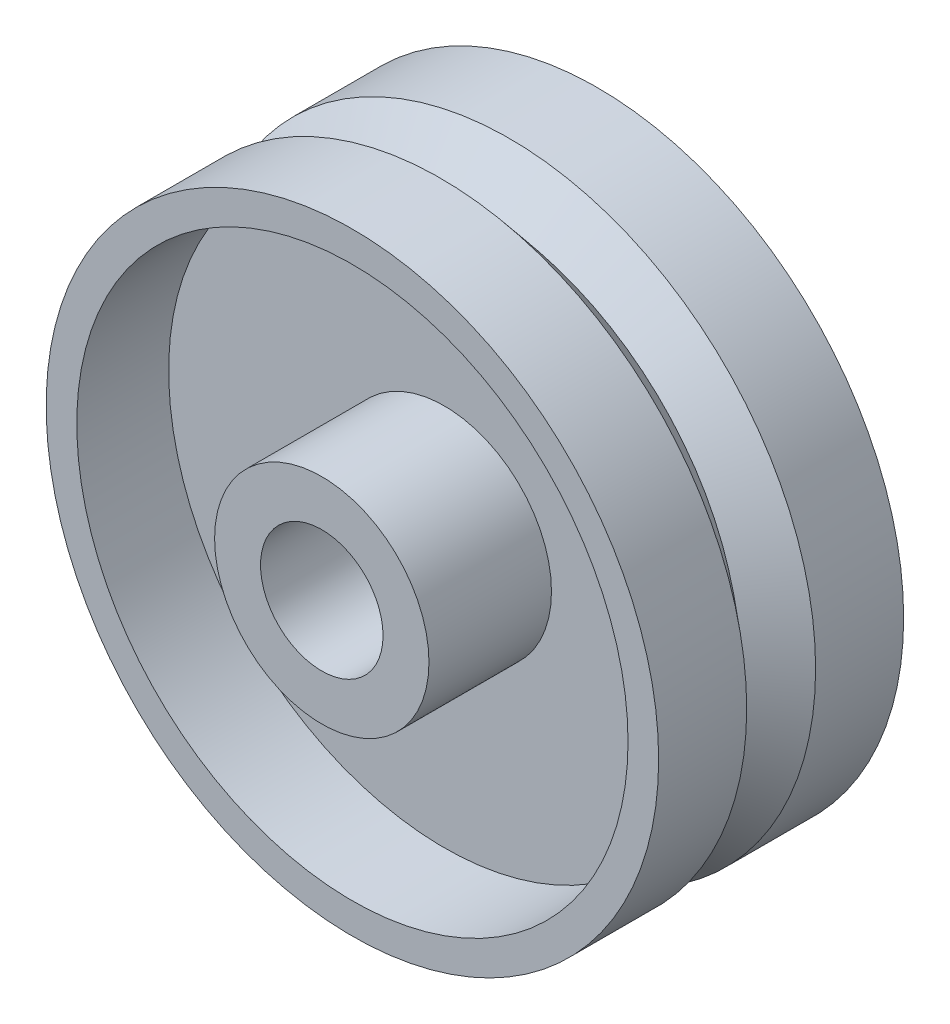
ISO-10303-21;
HEADER;
FILE_DESCRIPTION(('STEP AP214'),'2;1');
FILE_NAME('part.step','',(''),(''),'','','');
FILE_SCHEMA(('AUTOMOTIVE_DESIGN { 1 0 10303 214 1 1 1 1 }'));
ENDSEC;
DATA;
#1=APPLICATION_CONTEXT('core data for automotive mechanical design processes');
#2=APPLICATION_PROTOCOL_DEFINITION('international standard','automotive_design',2000,#1);
#3=PRODUCT_CONTEXT('',#1,'mechanical');
#4=PRODUCT('Part','Part','',(#3));
#5=PRODUCT_RELATED_PRODUCT_CATEGORY('part','',(#4));
#6=PRODUCT_DEFINITION_FORMATION('','',#4);
#7=PRODUCT_DEFINITION_CONTEXT('part definition',#1,'design');
#8=PRODUCT_DEFINITION('design','',#6,#7);
#9=PRODUCT_DEFINITION_SHAPE('','',#8);
#10=(LENGTH_UNIT() NAMED_UNIT(*) SI_UNIT(.MILLI.,.METRE.));
#11=(NAMED_UNIT(*) PLANE_ANGLE_UNIT() SI_UNIT($,.RADIAN.));
#12=(NAMED_UNIT(*) SI_UNIT($,.STERADIAN.) SOLID_ANGLE_UNIT());
#13=UNCERTAINTY_MEASURE_WITH_UNIT(LENGTH_MEASURE(1.E-05),#10,'distance_accuracy_value','');
#14=(GEOMETRIC_REPRESENTATION_CONTEXT(3) GLOBAL_UNCERTAINTY_ASSIGNED_CONTEXT((#13)) GLOBAL_UNIT_ASSIGNED_CONTEXT((#10,
#11,#12)) REPRESENTATION_CONTEXT('',''));
#15=CARTESIAN_POINT('',(0.,0.,0.));
#16=DIRECTION('',(0.,0.,1.));
#17=DIRECTION('',(1.,0.,0.));
#18=AXIS2_PLACEMENT_3D('',#15,#16,#17);
#19=CARTESIAN_POINT('',(0.,10.,25.));
#20=DIRECTION('',(0.,0.,-1.));
#21=DIRECTION('',(-1.,0.,0.));
#22=AXIS2_PLACEMENT_3D('',#19,#20,#21);
#23=PLANE('',#22);
#24=CARTESIAN_POINT('',(0.,0.,25.));
#25=DIRECTION('',(0.,0.,1.));
#26=DIRECTION('',(1.,0.,0.));
#27=AXIS2_PLACEMENT_3D('',#24,#25,#26);
#28=CIRCLE('',#27,10.);
#29=CARTESIAN_POINT('',(10.,0.,25.));
#30=VERTEX_POINT('',#29);
#31=EDGE_CURVE('E86',#30,#30,#28,.T.);
#32=ORIENTED_EDGE('',*,*,#31,.F.);
#33=EDGE_LOOP('',(#32));
#34=FACE_BOUND('',#33,.T.);
#35=CARTESIAN_POINT('',(0.,0.,25.));
#36=DIRECTION('',(0.,0.,1.));
#37=DIRECTION('',(1.,0.,0.));
#38=AXIS2_PLACEMENT_3D('',#35,#36,#37);
#39=CIRCLE('',#38,17.5);
#40=CARTESIAN_POINT('',(17.5,0.,25.));
#41=VERTEX_POINT('',#40);
#42=EDGE_CURVE('E10',#41,#41,#39,.T.);
#43=ORIENTED_EDGE('',*,*,#42,.T.);
#44=EDGE_LOOP('',(#43));
#45=FACE_BOUND('',#44,.T.);
#46=ADVANCED_FACE('F37',(#34,#45),#23,.F.);
#47=CARTESIAN_POINT('',(0.,0.,0.));
#48=DIRECTION('',(0.,0.,1.));
#49=DIRECTION('',(1.,0.,0.));
#50=AXIS2_PLACEMENT_3D('',#47,#48,#49);
#51=CYLINDRICAL_SURFACE('',#50,17.5);
#52=ORIENTED_EDGE('',*,*,#42,.F.);
#53=EDGE_LOOP('',(#52));
#54=FACE_BOUND('',#53,.T.);
#55=CARTESIAN_POINT('',(0.,0.,5.));
#56=DIRECTION('',(0.,0.,1.));
#57=DIRECTION('',(1.,0.,0.));
#58=AXIS2_PLACEMENT_3D('',#55,#56,#57);
#59=CIRCLE('',#58,17.5);
#60=CARTESIAN_POINT('',(17.5,0.,5.));
#61=VERTEX_POINT('',#60);
#62=EDGE_CURVE('E43',#61,#61,#59,.T.);
#63=ORIENTED_EDGE('',*,*,#62,.T.);
#64=EDGE_LOOP('',(#63));
#65=FACE_BOUND('',#64,.T.);
#66=ADVANCED_FACE('F93',(#54,#65),#51,.T.);
#67=CARTESIAN_POINT('',(0.,17.5,5.));
#68=DIRECTION('',(0.,0.,-1.));
#69=DIRECTION('',(-1.,0.,0.));
#70=AXIS2_PLACEMENT_3D('',#67,#68,#69);
#71=PLANE('',#70);
#72=ORIENTED_EDGE('',*,*,#62,.F.);
#73=EDGE_LOOP('',(#72));
#74=FACE_BOUND('',#73,.T.);
#75=CARTESIAN_POINT('',(0.,0.,5.00000000000001));
#76=DIRECTION('',(0.,0.,1.));
#77=DIRECTION('',(1.,0.,0.));
#78=AXIS2_PLACEMENT_3D('',#75,#76,#77);
#79=CIRCLE('',#78,45.);
#80=CARTESIAN_POINT('',(45.,0.,5.00000000000001));
#81=VERTEX_POINT('',#80);
#82=EDGE_CURVE('E47',#81,#81,#79,.T.);
#83=ORIENTED_EDGE('',*,*,#82,.T.);
#84=EDGE_LOOP('',(#83));
#85=FACE_BOUND('',#84,.T.);
#86=ADVANCED_FACE('F97',(#74,#85),#71,.F.);
#87=CARTESIAN_POINT('',(0.,0.,0.));
#88=DIRECTION('',(0.,0.,1.));
#89=DIRECTION('',(1.,0.,0.));
#90=AXIS2_PLACEMENT_3D('',#87,#88,#89);
#91=CYLINDRICAL_SURFACE('',#90,45.);
#92=ORIENTED_EDGE('',*,*,#82,.F.);
#93=EDGE_LOOP('',(#92));
#94=FACE_BOUND('',#93,.T.);
#95=CARTESIAN_POINT('',(0.,0.,20.));
#96=DIRECTION('',(0.,0.,1.));
#97=DIRECTION('',(1.,0.,0.));
#98=AXIS2_PLACEMENT_3D('',#95,#96,#97);
#99=CIRCLE('',#98,45.);
#100=CARTESIAN_POINT('',(45.,0.,20.));
#101=VERTEX_POINT('',#100);
#102=EDGE_CURVE('E51',#101,#101,#99,.T.);
#103=ORIENTED_EDGE('',*,*,#102,.T.);
#104=EDGE_LOOP('',(#103));
#105=FACE_BOUND('',#104,.T.);
#106=ADVANCED_FACE('F102',(#94,#105),#91,.F.);
#107=CARTESIAN_POINT('',(0.,45.,20.));
#108=DIRECTION('',(0.,0.,-1.));
#109=DIRECTION('',(-1.,0.,0.));
#110=AXIS2_PLACEMENT_3D('',#107,#108,#109);
#111=PLANE('',#110);
#112=ORIENTED_EDGE('',*,*,#102,.F.);
#113=EDGE_LOOP('',(#112));
#114=FACE_BOUND('',#113,.T.);
#115=CARTESIAN_POINT('',(0.,0.,20.));
#116=DIRECTION('',(0.,0.,1.));
#117=DIRECTION('',(1.,0.,0.));
#118=AXIS2_PLACEMENT_3D('',#115,#116,#117);
#119=CIRCLE('',#118,50.);
#120=CARTESIAN_POINT('',(50.,0.,20.));
#121=VERTEX_POINT('',#120);
#122=EDGE_CURVE('E56',#121,#121,#119,.T.);
#123=ORIENTED_EDGE('',*,*,#122,.T.);
#124=EDGE_LOOP('',(#123));
#125=FACE_BOUND('',#124,.T.);
#126=ADVANCED_FACE('F108',(#114,#125),#111,.F.);
#127=CARTESIAN_POINT('',(0.,0.,0.));
#128=DIRECTION('',(0.,0.,1.));
#129=DIRECTION('',(1.,0.,0.));
#130=AXIS2_PLACEMENT_3D('',#127,#128,#129);
#131=CYLINDRICAL_SURFACE('',#130,50.);
#132=ORIENTED_EDGE('',*,*,#122,.F.);
#133=EDGE_LOOP('',(#132));
#134=FACE_BOUND('',#133,.T.);
#135=CARTESIAN_POINT('',(0.,0.,5.62522963797609));
#136=DIRECTION('',(0.,0.,1.));
#137=DIRECTION('',(1.,0.,0.));
#138=AXIS2_PLACEMENT_3D('',#135,#136,#137);
#139=CIRCLE('',#138,50.);
#140=CARTESIAN_POINT('',(50.,0.,5.62522963797609));
#141=VERTEX_POINT('',#140);
#142=EDGE_CURVE('E59',#141,#141,#139,.T.);
#143=ORIENTED_EDGE('',*,*,#142,.T.);
#144=EDGE_LOOP('',(#143));
#145=FACE_BOUND('',#144,.T.);
#146=ADVANCED_FACE('F112',(#134,#145),#131,.T.);
#147=CARTESIAN_POINT('',(0.,0.,0.));
#148=DIRECTION('',(0.,0.,1.));
#149=DIRECTION('',(1.,0.,0.));
#150=AXIS2_PLACEMENT_3D('',#147,#148,#149);
#151=CONICAL_SURFACE('',#150,43.2961123697745,0.872664625997171);
#152=ORIENTED_EDGE('',*,*,#142,.F.);
#153=EDGE_LOOP('',(#152));
#154=FACE_BOUND('',#153,.T.);
#155=CARTESIAN_POINT('',(0.,0.,0.));
#156=DIRECTION('',(0.,0.,1.));
#157=DIRECTION('',(1.,0.,0.));
#158=AXIS2_PLACEMENT_3D('',#155,#156,#157);
#159=CIRCLE('',#158,43.2961123697745);
#160=CARTESIAN_POINT('',(43.2961123697745,0.,0.));
#161=VERTEX_POINT('',#160);
#162=EDGE_CURVE('E62',#161,#161,#159,.T.);
#163=ORIENTED_EDGE('',*,*,#162,.T.);
#164=EDGE_LOOP('',(#163));
#165=FACE_BOUND('',#164,.T.);
#166=ADVANCED_FACE('F116',(#154,#165),#151,.T.);
#167=CARTESIAN_POINT('',(0.,0.,-5.6252296379761));
#168=DIRECTION('',(0.,0.,-1.));
#169=DIRECTION('',(-1.,0.,0.));
#170=AXIS2_PLACEMENT_3D('',#167,#168,#169);
#171=CONICAL_SURFACE('',#170,50.,0.872664625997171);
#172=ORIENTED_EDGE('',*,*,#162,.F.);
#173=EDGE_LOOP('',(#172));
#174=FACE_BOUND('',#173,.T.);
#175=CARTESIAN_POINT('',(0.,0.,-5.6252296379761));
#176=DIRECTION('',(0.,0.,1.));
#177=DIRECTION('',(1.,0.,0.));
#178=AXIS2_PLACEMENT_3D('',#175,#176,#177);
#179=CIRCLE('',#178,50.);
#180=CARTESIAN_POINT('',(50.,0.,-5.6252296379761));
#181=VERTEX_POINT('',#180);
#182=EDGE_CURVE('E65',#181,#181,#179,.T.);
#183=ORIENTED_EDGE('',*,*,#182,.T.);
#184=EDGE_LOOP('',(#183));
#185=FACE_BOUND('',#184,.T.);
#186=ADVANCED_FACE('F120',(#174,#185),#171,.T.);
#187=CARTESIAN_POINT('',(0.,0.,0.));
#188=DIRECTION('',(0.,0.,1.));
#189=DIRECTION('',(1.,0.,0.));
#190=AXIS2_PLACEMENT_3D('',#187,#188,#189);
#191=CYLINDRICAL_SURFACE('',#190,50.);
#192=ORIENTED_EDGE('',*,*,#182,.F.);
#193=EDGE_LOOP('',(#192));
#194=FACE_BOUND('',#193,.T.);
#195=CARTESIAN_POINT('',(0.,0.,-20.));
#196=DIRECTION('',(0.,0.,1.));
#197=DIRECTION('',(1.,0.,0.));
#198=AXIS2_PLACEMENT_3D('',#195,#196,#197);
#199=CIRCLE('',#198,50.);
#200=CARTESIAN_POINT('',(50.,0.,-20.));
#201=VERTEX_POINT('',#200);
#202=EDGE_CURVE('E68',#201,#201,#199,.T.);
#203=ORIENTED_EDGE('',*,*,#202,.T.);
#204=EDGE_LOOP('',(#203));
#205=FACE_BOUND('',#204,.T.);
#206=ADVANCED_FACE('F124',(#194,#205),#191,.T.);
#207=CARTESIAN_POINT('',(0.,50.,-20.));
#208=DIRECTION('',(0.,0.,1.));
#209=DIRECTION('',(1.,0.,0.));
#210=AXIS2_PLACEMENT_3D('',#207,#208,#209);
#211=PLANE('',#210);
#212=ORIENTED_EDGE('',*,*,#202,.F.);
#213=EDGE_LOOP('',(#212));
#214=FACE_BOUND('',#213,.T.);
#215=CARTESIAN_POINT('',(0.,0.,-20.));
#216=DIRECTION('',(0.,0.,1.));
#217=DIRECTION('',(1.,0.,0.));
#218=AXIS2_PLACEMENT_3D('',#215,#216,#217);
#219=CIRCLE('',#218,45.);
#220=CARTESIAN_POINT('',(45.,0.,-20.));
#221=VERTEX_POINT('',#220);
#222=EDGE_CURVE('E71',#221,#221,#219,.T.);
#223=ORIENTED_EDGE('',*,*,#222,.T.);
#224=EDGE_LOOP('',(#223));
#225=FACE_BOUND('',#224,.T.);
#226=ADVANCED_FACE('F128',(#214,#225),#211,.F.);
#227=CARTESIAN_POINT('',(0.,0.,0.));
#228=DIRECTION('',(0.,0.,1.));
#229=DIRECTION('',(1.,0.,0.));
#230=AXIS2_PLACEMENT_3D('',#227,#228,#229);
#231=CYLINDRICAL_SURFACE('',#230,45.);
#232=ORIENTED_EDGE('',*,*,#222,.F.);
#233=EDGE_LOOP('',(#232));
#234=FACE_BOUND('',#233,.T.);
#235=CARTESIAN_POINT('',(0.,0.,-4.99999999999999));
#236=DIRECTION('',(0.,0.,1.));
#237=DIRECTION('',(1.,0.,0.));
#238=AXIS2_PLACEMENT_3D('',#235,#236,#237);
#239=CIRCLE('',#238,45.);
#240=CARTESIAN_POINT('',(45.,0.,-4.99999999999999));
#241=VERTEX_POINT('',#240);
#242=EDGE_CURVE('E74',#241,#241,#239,.T.);
#243=ORIENTED_EDGE('',*,*,#242,.T.);
#244=EDGE_LOOP('',(#243));
#245=FACE_BOUND('',#244,.T.);
#246=ADVANCED_FACE('F132',(#234,#245),#231,.F.);
#247=CARTESIAN_POINT('',(0.,45.,-5.));
#248=DIRECTION('',(0.,0.,1.));
#249=DIRECTION('',(1.,0.,0.));
#250=AXIS2_PLACEMENT_3D('',#247,#248,#249);
#251=PLANE('',#250);
#252=ORIENTED_EDGE('',*,*,#242,.F.);
#253=EDGE_LOOP('',(#252));
#254=FACE_BOUND('',#253,.T.);
#255=CARTESIAN_POINT('',(0.,0.,-5.));
#256=DIRECTION('',(0.,0.,1.));
#257=DIRECTION('',(1.,0.,0.));
#258=AXIS2_PLACEMENT_3D('',#255,#256,#257);
#259=CIRCLE('',#258,17.5);
#260=CARTESIAN_POINT('',(17.5,0.,-5.));
#261=VERTEX_POINT('',#260);
#262=EDGE_CURVE('E77',#261,#261,#259,.T.);
#263=ORIENTED_EDGE('',*,*,#262,.T.);
#264=EDGE_LOOP('',(#263));
#265=FACE_BOUND('',#264,.T.);
#266=ADVANCED_FACE('F136',(#254,#265),#251,.F.);
#267=CARTESIAN_POINT('',(0.,0.,0.));
#268=DIRECTION('',(0.,0.,1.));
#269=DIRECTION('',(1.,0.,0.));
#270=AXIS2_PLACEMENT_3D('',#267,#268,#269);
#271=CYLINDRICAL_SURFACE('',#270,17.5);
#272=ORIENTED_EDGE('',*,*,#262,.F.);
#273=EDGE_LOOP('',(#272));
#274=FACE_BOUND('',#273,.T.);
#275=CARTESIAN_POINT('',(0.,0.,-25.));
#276=DIRECTION('',(0.,0.,1.));
#277=DIRECTION('',(1.,0.,0.));
#278=AXIS2_PLACEMENT_3D('',#275,#276,#277);
#279=CIRCLE('',#278,17.5);
#280=CARTESIAN_POINT('',(17.5,0.,-25.));
#281=VERTEX_POINT('',#280);
#282=EDGE_CURVE('E80',#281,#281,#279,.T.);
#283=ORIENTED_EDGE('',*,*,#282,.T.);
#284=EDGE_LOOP('',(#283));
#285=FACE_BOUND('',#284,.T.);
#286=ADVANCED_FACE('F140',(#274,#285),#271,.T.);
#287=CARTESIAN_POINT('',(0.,17.5,-25.));
#288=DIRECTION('',(0.,0.,1.));
#289=DIRECTION('',(1.,0.,0.));
#290=AXIS2_PLACEMENT_3D('',#287,#288,#289);
#291=PLANE('',#290);
#292=ORIENTED_EDGE('',*,*,#282,.F.);
#293=EDGE_LOOP('',(#292));
#294=FACE_BOUND('',#293,.T.);
#295=CARTESIAN_POINT('',(0.,0.,-25.));
#296=DIRECTION('',(0.,0.,1.));
#297=DIRECTION('',(1.,0.,0.));
#298=AXIS2_PLACEMENT_3D('',#295,#296,#297);
#299=CIRCLE('',#298,10.);
#300=CARTESIAN_POINT('',(10.,0.,-25.));
#301=VERTEX_POINT('',#300);
#302=EDGE_CURVE('E83',#301,#301,#299,.T.);
#303=ORIENTED_EDGE('',*,*,#302,.T.);
#304=EDGE_LOOP('',(#303));
#305=FACE_BOUND('',#304,.T.);
#306=ADVANCED_FACE('F144',(#294,#305),#291,.F.);
#307=CARTESIAN_POINT('',(0.,0.,0.));
#308=DIRECTION('',(0.,0.,1.));
#309=DIRECTION('',(1.,0.,0.));
#310=AXIS2_PLACEMENT_3D('',#307,#308,#309);
#311=CYLINDRICAL_SURFACE('',#310,10.);
#312=ORIENTED_EDGE('',*,*,#302,.F.);
#313=EDGE_LOOP('',(#312));
#314=FACE_BOUND('',#313,.T.);
#315=ORIENTED_EDGE('',*,*,#31,.T.);
#316=EDGE_LOOP('',(#315));
#317=FACE_BOUND('',#316,.T.);
#318=ADVANCED_FACE('F90',(#314,#317),#311,.F.);
#319=CLOSED_SHELL('',(#46,#66,#86,#106,#126,#146,#166,#186,#206,#226,#246,#266,#286,#306,#318));
#320=MANIFOLD_SOLID_BREP('B2',#319);
#321=ADVANCED_BREP_SHAPE_REPRESENTATION('',(#18,#320),#14);
#322=SHAPE_DEFINITION_REPRESENTATION(#9,#321);
ENDSEC;
END-ISO-10303-21;
